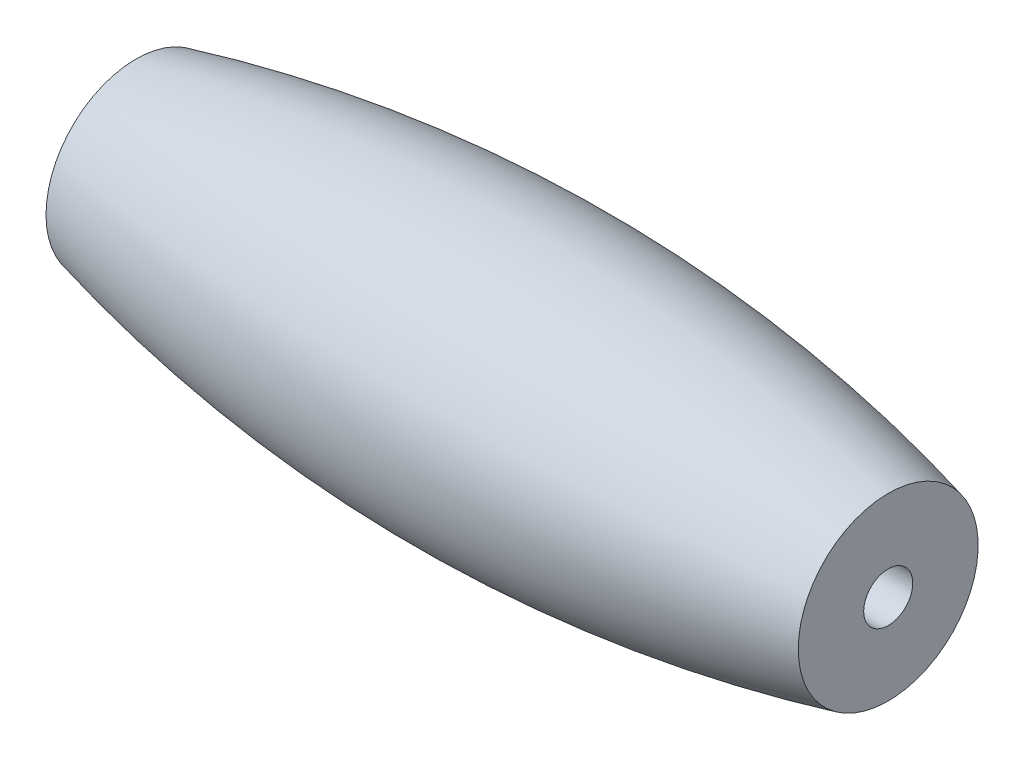
ISO-10303-21;
HEADER;
FILE_DESCRIPTION(('STEP AP214'),'2;1');
FILE_NAME('part.step','',(''),(''),'','','');
FILE_SCHEMA(('AUTOMOTIVE_DESIGN { 1 0 10303 214 1 1 1 1 }'));
ENDSEC;
DATA;
#1=APPLICATION_CONTEXT('core data for automotive mechanical design processes');
#2=APPLICATION_PROTOCOL_DEFINITION('international standard','automotive_design',2000,#1);
#3=PRODUCT_CONTEXT('',#1,'mechanical');
#4=PRODUCT('Part','Part','',(#3));
#5=PRODUCT_RELATED_PRODUCT_CATEGORY('part','',(#4));
#6=PRODUCT_DEFINITION_FORMATION('','',#4);
#7=PRODUCT_DEFINITION_CONTEXT('part definition',#1,'design');
#8=PRODUCT_DEFINITION('design','',#6,#7);
#9=PRODUCT_DEFINITION_SHAPE('','',#8);
#10=(LENGTH_UNIT() NAMED_UNIT(*) SI_UNIT(.MILLI.,.METRE.));
#11=(NAMED_UNIT(*) PLANE_ANGLE_UNIT() SI_UNIT($,.RADIAN.));
#12=(NAMED_UNIT(*) SI_UNIT($,.STERADIAN.) SOLID_ANGLE_UNIT());
#13=UNCERTAINTY_MEASURE_WITH_UNIT(LENGTH_MEASURE(1.E-05),#10,'distance_accuracy_value','');
#14=(GEOMETRIC_REPRESENTATION_CONTEXT(3) GLOBAL_UNCERTAINTY_ASSIGNED_CONTEXT((#13)) GLOBAL_UNIT_ASSIGNED_CONTEXT((#10,
#11,#12)) REPRESENTATION_CONTEXT('',''));
#15=CARTESIAN_POINT('',(0.,0.,0.));
#16=DIRECTION('',(0.,0.,1.));
#17=DIRECTION('',(1.,0.,0.));
#18=AXIS2_PLACEMENT_3D('',#15,#16,#17);
#19=CARTESIAN_POINT('',(46.,11.,0.));
#20=DIRECTION('',(-1.,0.,0.));
#21=DIRECTION('',(0.,0.,1.));
#22=AXIS2_PLACEMENT_3D('',#19,#20,#21);
#23=DEGENERATE_TOROIDAL_SURFACE('',#22,173.347497948847,190.,.F.);
#24=CARTESIAN_POINT('',(92.,11.,0.));
#25=DIRECTION('',(-1.,0.,0.));
#26=DIRECTION('',(0.,0.,1.));
#27=AXIS2_PLACEMENT_3D('',#24,#25,#26);
#28=CIRCLE('',#27,11.);
#29=CARTESIAN_POINT('',(92.,11.,11.));
#30=VERTEX_POINT('',#29);
#31=EDGE_CURVE('E43',#30,#30,#28,.T.);
#32=ORIENTED_EDGE('',*,*,#31,.T.);
#33=EDGE_LOOP('',(#32));
#34=FACE_BOUND('',#33,.T.);
#35=CARTESIAN_POINT('',(0.,11.,0.));
#36=DIRECTION('',(-1.,0.,0.));
#37=DIRECTION('',(0.,0.,1.));
#38=AXIS2_PLACEMENT_3D('',#35,#36,#37);
#39=CIRCLE('',#38,11.);
#40=CARTESIAN_POINT('',(0.,11.,11.));
#41=VERTEX_POINT('',#40);
#42=EDGE_CURVE('E10',#41,#41,#39,.T.);
#43=ORIENTED_EDGE('',*,*,#42,.F.);
#44=EDGE_LOOP('',(#43));
#45=FACE_BOUND('',#44,.T.);
#46=ADVANCED_FACE('F36',(#34,#45),#23,.F.);
#47=CARTESIAN_POINT('',(0.,0.,0.));
#48=DIRECTION('',(-1.,0.,0.));
#49=DIRECTION('',(0.,0.,1.));
#50=AXIS2_PLACEMENT_3D('',#47,#48,#49);
#51=PLANE('',#50);
#52=CARTESIAN_POINT('',(0.,11.,0.));
#53=DIRECTION('',(-1.,0.,0.));
#54=DIRECTION('',(0.,0.,1.));
#55=AXIS2_PLACEMENT_3D('',#52,#53,#54);
#56=CIRCLE('',#55,3.);
#57=CARTESIAN_POINT('',(0.,11.,3.));
#58=VERTEX_POINT('',#57);
#59=EDGE_CURVE('E49',#58,#58,#56,.T.);
#60=ORIENTED_EDGE('',*,*,#59,.F.);
#61=EDGE_LOOP('',(#60));
#62=FACE_BOUND('',#61,.T.);
#63=ORIENTED_EDGE('',*,*,#42,.T.);
#64=EDGE_LOOP('',(#63));
#65=FACE_BOUND('',#64,.T.);
#66=ADVANCED_FACE('F61',(#62,#65),#51,.T.);
#67=CARTESIAN_POINT('',(92.,11.,0.));
#68=DIRECTION('',(1.,0.,0.));
#69=DIRECTION('',(0.,0.,-1.));
#70=AXIS2_PLACEMENT_3D('',#67,#68,#69);
#71=PLANE('',#70);
#72=CARTESIAN_POINT('',(92.,11.,0.));
#73=DIRECTION('',(1.,0.,0.));
#74=DIRECTION('',(0.,0.,-1.));
#75=AXIS2_PLACEMENT_3D('',#72,#73,#74);
#76=CIRCLE('',#75,3.);
#77=CARTESIAN_POINT('',(92.,11.,-3.));
#78=VERTEX_POINT('',#77);
#79=EDGE_CURVE('E39',#78,#78,#76,.T.);
#80=ORIENTED_EDGE('',*,*,#79,.F.);
#81=EDGE_LOOP('',(#80));
#82=FACE_BOUND('',#81,.T.);
#83=ORIENTED_EDGE('',*,*,#31,.F.);
#84=EDGE_LOOP('',(#83));
#85=FACE_BOUND('',#84,.T.);
#86=ADVANCED_FACE('F58',(#82,#85),#71,.T.);
#87=CARTESIAN_POINT('',(100.,11.,0.));
#88=DIRECTION('',(-1.,0.,0.));
#89=DIRECTION('',(0.,0.,1.));
#90=AXIS2_PLACEMENT_3D('',#87,#88,#89);
#91=CYLINDRICAL_SURFACE('',#90,3.);
#92=ORIENTED_EDGE('',*,*,#79,.T.);
#93=EDGE_LOOP('',(#92));
#94=FACE_BOUND('',#93,.T.);
#95=ORIENTED_EDGE('',*,*,#59,.T.);
#96=EDGE_LOOP('',(#95));
#97=FACE_BOUND('',#96,.T.);
#98=ADVANCED_FACE('F56',(#94,#97),#91,.F.);
#99=CLOSED_SHELL('',(#46,#66,#86,#98));
#100=MANIFOLD_SOLID_BREP('B2',#99);
#101=ADVANCED_BREP_SHAPE_REPRESENTATION('',(#18,#100),#14);
#102=SHAPE_DEFINITION_REPRESENTATION(#9,#101);
ENDSEC;
END-ISO-10303-21;
